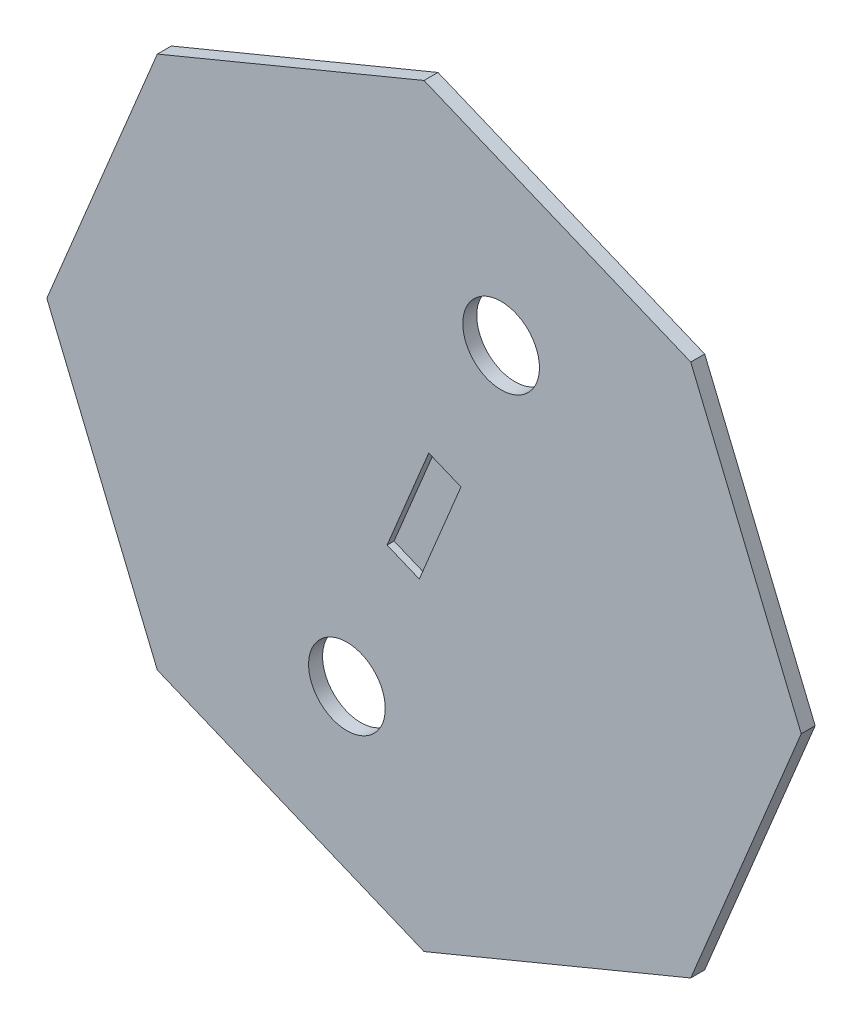
ISO-10303-21;
HEADER;
FILE_DESCRIPTION(('STEP AP214'),'2;1');
FILE_NAME('part.step','',(''),(''),'','','');
FILE_SCHEMA(('AUTOMOTIVE_DESIGN { 1 0 10303 214 1 1 1 1 }'));
ENDSEC;
DATA;
#1=APPLICATION_CONTEXT('core data for automotive mechanical design processes');
#2=APPLICATION_PROTOCOL_DEFINITION('international standard','automotive_design',2000,#1);
#3=PRODUCT_CONTEXT('',#1,'mechanical');
#4=PRODUCT('Part','Part','',(#3));
#5=PRODUCT_RELATED_PRODUCT_CATEGORY('part','',(#4));
#6=PRODUCT_DEFINITION_FORMATION('','',#4);
#7=PRODUCT_DEFINITION_CONTEXT('part definition',#1,'design');
#8=PRODUCT_DEFINITION('design','',#6,#7);
#9=PRODUCT_DEFINITION_SHAPE('','',#8);
#10=(LENGTH_UNIT() NAMED_UNIT(*) SI_UNIT(.MILLI.,.METRE.));
#11=(NAMED_UNIT(*) PLANE_ANGLE_UNIT() SI_UNIT($,.RADIAN.));
#12=(NAMED_UNIT(*) SI_UNIT($,.STERADIAN.) SOLID_ANGLE_UNIT());
#13=UNCERTAINTY_MEASURE_WITH_UNIT(LENGTH_MEASURE(1.E-05),#10,'distance_accuracy_value','');
#14=(GEOMETRIC_REPRESENTATION_CONTEXT(3) GLOBAL_UNCERTAINTY_ASSIGNED_CONTEXT((#13)) GLOBAL_UNIT_ASSIGNED_CONTEXT((#10,
#11,#12)) REPRESENTATION_CONTEXT('',''));
#15=CARTESIAN_POINT('',(0.,0.,0.));
#16=DIRECTION('',(0.,0.,1.));
#17=DIRECTION('',(1.,0.,0.));
#18=AXIS2_PLACEMENT_3D('',#15,#16,#17);
#19=CARTESIAN_POINT('',(76.5366864730186,-76.5366864730173,4.));
#20=DIRECTION('',(-0.92387953251129,0.382683432365081,0.));
#21=DIRECTION('',(-0.382683432365081,-0.92387953251129,0.));
#22=AXIS2_PLACEMENT_3D('',#19,#20,#21);
#23=PLANE('',#22);
#24=DIRECTION('',(0.382683432365081,0.92387953251129,0.));
#25=VECTOR('',#24,1.);
#26=CARTESIAN_POINT('',(76.5366864730186,-76.5366864730173,0.));
#27=LINE('',#26,#25);
#28=CARTESIAN_POINT('',(76.5366864730186,-76.5366864730173,0.));
#29=VERTEX_POINT('',#28);
#30=CARTESIAN_POINT('',(108.239220029239,1.03926162249669E-12,0.));
#31=VERTEX_POINT('',#30);
#32=EDGE_CURVE('E141',#29,#31,#27,.T.);
#33=ORIENTED_EDGE('',*,*,#32,.T.);
#34=DIRECTION('',(0.,0.,-1.));
#35=VECTOR('',#34,1.);
#36=CARTESIAN_POINT('',(108.239220029239,1.03926162249669E-12,4.));
#37=LINE('',#36,#35);
#38=CARTESIAN_POINT('',(108.239220029239,1.03926162249669E-12,4.));
#39=VERTEX_POINT('',#38);
#40=EDGE_CURVE('E11',#39,#31,#37,.T.);
#41=ORIENTED_EDGE('',*,*,#40,.F.);
#42=DIRECTION('',(0.382683432365081,0.92387953251129,0.));
#43=VECTOR('',#42,1.);
#44=CARTESIAN_POINT('',(76.5366864730186,-76.5366864730173,4.));
#45=LINE('',#44,#43);
#46=CARTESIAN_POINT('',(76.5366864730186,-76.5366864730173,4.));
#47=VERTEX_POINT('',#46);
#48=EDGE_CURVE('E157',#47,#39,#45,.T.);
#49=ORIENTED_EDGE('',*,*,#48,.F.);
#50=DIRECTION('',(0.,0.,-1.));
#51=VECTOR('',#50,1.);
#52=CARTESIAN_POINT('',(76.5366864730186,-76.5366864730173,4.));
#53=LINE('',#52,#51);
#54=EDGE_CURVE('E137',#47,#29,#53,.T.);
#55=ORIENTED_EDGE('',*,*,#54,.T.);
#56=EDGE_LOOP('',(#33,#41,#49,#55));
#57=FACE_BOUND('',#56,.T.);
#58=ADVANCED_FACE('F33',(#57),#23,.F.);
#59=CARTESIAN_POINT('',(108.239220029239,1.03926162249669E-12,4.));
#60=DIRECTION('',(-0.923879532511283,-0.382683432365099,0.));
#61=DIRECTION('',(0.382683432365099,-0.923879532511283,0.));
#62=AXIS2_PLACEMENT_3D('',#59,#60,#61);
#63=PLANE('',#62);
#64=DIRECTION('',(-0.382683432365099,0.923879532511283,0.));
#65=VECTOR('',#64,1.);
#66=CARTESIAN_POINT('',(108.239220029239,1.03926162249669E-12,0.));
#67=LINE('',#66,#65);
#68=CARTESIAN_POINT('',(76.5366864730173,76.5366864730186,0.));
#69=VERTEX_POINT('',#68);
#70=EDGE_CURVE('E144',#31,#69,#67,.T.);
#71=ORIENTED_EDGE('',*,*,#70,.T.);
#72=DIRECTION('',(0.,0.,-1.));
#73=VECTOR('',#72,1.);
#74=CARTESIAN_POINT('',(76.5366864730173,76.5366864730186,4.));
#75=LINE('',#74,#73);
#76=CARTESIAN_POINT('',(76.5366864730173,76.5366864730186,4.));
#77=VERTEX_POINT('',#76);
#78=EDGE_CURVE('E40',#77,#69,#75,.T.);
#79=ORIENTED_EDGE('',*,*,#78,.F.);
#80=DIRECTION('',(-0.382683432365099,0.923879532511283,0.));
#81=VECTOR('',#80,1.);
#82=CARTESIAN_POINT('',(108.239220029239,1.03926162249669E-12,4.));
#83=LINE('',#82,#81);
#84=EDGE_CURVE('E97',#39,#77,#83,.T.);
#85=ORIENTED_EDGE('',*,*,#84,.F.);
#86=ORIENTED_EDGE('',*,*,#40,.T.);
#87=EDGE_LOOP('',(#71,#79,#85,#86));
#88=FACE_BOUND('',#87,.T.);
#89=ADVANCED_FACE('F288',(#88),#63,.F.);
#90=CARTESIAN_POINT('',(76.5366864730173,76.5366864730186,4.));
#91=DIRECTION('',(-0.382683432365081,-0.92387953251129,0.));
#92=DIRECTION('',(0.92387953251129,-0.382683432365081,0.));
#93=AXIS2_PLACEMENT_3D('',#90,#91,#92);
#94=PLANE('',#93);
#95=DIRECTION('',(-0.92387953251129,0.382683432365081,0.));
#96=VECTOR('',#95,1.);
#97=CARTESIAN_POINT('',(76.5366864730173,76.5366864730186,0.));
#98=LINE('',#97,#96);
#99=CARTESIAN_POINT('',(-1.01381184269642E-12,108.239220029239,0.));
#100=VERTEX_POINT('',#99);
#101=EDGE_CURVE('E147',#69,#100,#98,.T.);
#102=ORIENTED_EDGE('',*,*,#101,.T.);
#103=DIRECTION('',(0.,0.,-1.));
#104=VECTOR('',#103,1.);
#105=CARTESIAN_POINT('',(-1.01381184269642E-12,108.239220029239,4.));
#106=LINE('',#105,#104);
#107=CARTESIAN_POINT('',(-1.01381184269642E-12,108.239220029239,4.));
#108=VERTEX_POINT('',#107);
#109=EDGE_CURVE('E164',#108,#100,#106,.T.);
#110=ORIENTED_EDGE('',*,*,#109,.F.);
#111=DIRECTION('',(-0.92387953251129,0.382683432365081,0.));
#112=VECTOR('',#111,1.);
#113=CARTESIAN_POINT('',(76.5366864730173,76.5366864730186,4.));
#114=LINE('',#113,#112);
#115=EDGE_CURVE('E172',#77,#108,#114,.T.);
#116=ORIENTED_EDGE('',*,*,#115,.F.);
#117=ORIENTED_EDGE('',*,*,#78,.T.);
#118=EDGE_LOOP('',(#102,#110,#116,#117));
#119=FACE_BOUND('',#118,.T.);
#120=ADVANCED_FACE('F170',(#119),#94,.F.);
#121=CARTESIAN_POINT('',(-1.01381184269642E-12,108.239220029239,4.));
#122=DIRECTION('',(0.382683432365098,-0.923879532511283,0.));
#123=DIRECTION('',(0.923879532511283,0.382683432365098,0.));
#124=AXIS2_PLACEMENT_3D('',#121,#122,#123);
#125=PLANE('',#124);
#126=DIRECTION('',(-0.923879532511283,-0.382683432365098,0.));
#127=VECTOR('',#126,1.);
#128=CARTESIAN_POINT('',(-1.01381184269642E-12,108.239220029239,0.));
#129=LINE('',#128,#127);
#130=CARTESIAN_POINT('',(-76.5366864730187,76.5366864730172,0.));
#131=VERTEX_POINT('',#130);
#132=EDGE_CURVE('E149',#100,#131,#129,.T.);
#133=ORIENTED_EDGE('',*,*,#132,.T.);
#134=DIRECTION('',(0.,0.,-1.));
#135=VECTOR('',#134,1.);
#136=CARTESIAN_POINT('',(-76.5366864730187,76.5366864730172,4.));
#137=LINE('',#136,#135);
#138=CARTESIAN_POINT('',(-76.5366864730187,76.5366864730172,4.));
#139=VERTEX_POINT('',#138);
#140=EDGE_CURVE('E161',#139,#131,#137,.T.);
#141=ORIENTED_EDGE('',*,*,#140,.F.);
#142=DIRECTION('',(-0.923879532511283,-0.382683432365098,0.));
#143=VECTOR('',#142,1.);
#144=CARTESIAN_POINT('',(-1.01381184269642E-12,108.239220029239,4.));
#145=LINE('',#144,#143);
#146=EDGE_CURVE('E184',#108,#139,#145,.T.);
#147=ORIENTED_EDGE('',*,*,#146,.F.);
#148=ORIENTED_EDGE('',*,*,#109,.T.);
#149=EDGE_LOOP('',(#133,#141,#147,#148));
#150=FACE_BOUND('',#149,.T.);
#151=ADVANCED_FACE('F180',(#150),#125,.F.);
#152=CARTESIAN_POINT('',(-76.5366864730187,76.5366864730172,4.));
#153=DIRECTION('',(0.92387953251129,-0.382683432365081,0.));
#154=DIRECTION('',(0.382683432365081,0.92387953251129,0.));
#155=AXIS2_PLACEMENT_3D('',#152,#153,#154);
#156=PLANE('',#155);
#157=DIRECTION('',(-0.382683432365081,-0.92387953251129,0.));
#158=VECTOR('',#157,1.);
#159=CARTESIAN_POINT('',(-76.5366864730187,76.5366864730172,0.));
#160=LINE('',#159,#158);
#161=CARTESIAN_POINT('',(-108.239220029239,-1.00427204748501E-12,0.));
#162=VERTEX_POINT('',#161);
#163=EDGE_CURVE('E151',#131,#162,#160,.T.);
#164=ORIENTED_EDGE('',*,*,#163,.T.);
#165=DIRECTION('',(0.,0.,-1.));
#166=VECTOR('',#165,1.);
#167=CARTESIAN_POINT('',(-108.239220029239,-1.00427204748501E-12,4.));
#168=LINE('',#167,#166);
#169=CARTESIAN_POINT('',(-108.239220029239,-1.00427204748501E-12,4.));
#170=VERTEX_POINT('',#169);
#171=EDGE_CURVE('E132',#170,#162,#168,.T.);
#172=ORIENTED_EDGE('',*,*,#171,.F.);
#173=DIRECTION('',(-0.382683432365081,-0.92387953251129,0.));
#174=VECTOR('',#173,1.);
#175=CARTESIAN_POINT('',(-76.5366864730187,76.5366864730172,4.));
#176=LINE('',#175,#174);
#177=EDGE_CURVE('E120',#139,#170,#176,.T.);
#178=ORIENTED_EDGE('',*,*,#177,.F.);
#179=ORIENTED_EDGE('',*,*,#140,.T.);
#180=EDGE_LOOP('',(#164,#172,#178,#179));
#181=FACE_BOUND('',#180,.T.);
#182=ADVANCED_FACE('F183',(#181),#156,.F.);
#183=CARTESIAN_POINT('',(-108.239220029239,-1.00427204748501E-12,4.));
#184=DIRECTION('',(0.923879532511283,0.382683432365098,0.));
#185=DIRECTION('',(-0.382683432365098,0.923879532511283,0.));
#186=AXIS2_PLACEMENT_3D('',#183,#184,#185);
#187=PLANE('',#186);
#188=DIRECTION('',(0.382683432365098,-0.923879532511283,0.));
#189=VECTOR('',#188,1.);
#190=CARTESIAN_POINT('',(-108.239220029239,-1.00427204748501E-12,0.));
#191=LINE('',#190,#189);
#192=CARTESIAN_POINT('',(-76.5366864730173,-76.5366864730187,0.));
#193=VERTEX_POINT('',#192);
#194=EDGE_CURVE('E129',#162,#193,#191,.T.);
#195=ORIENTED_EDGE('',*,*,#194,.T.);
#196=DIRECTION('',(0.,0.,-1.));
#197=VECTOR('',#196,1.);
#198=CARTESIAN_POINT('',(-76.5366864730173,-76.5366864730187,4.));
#199=LINE('',#198,#197);
#200=CARTESIAN_POINT('',(-76.5366864730173,-76.5366864730187,4.));
#201=VERTEX_POINT('',#200);
#202=EDGE_CURVE('E126',#201,#193,#199,.T.);
#203=ORIENTED_EDGE('',*,*,#202,.F.);
#204=DIRECTION('',(0.382683432365098,-0.923879532511283,0.));
#205=VECTOR('',#204,1.);
#206=CARTESIAN_POINT('',(-108.239220029239,-1.00427204748501E-12,4.));
#207=LINE('',#206,#205);
#208=EDGE_CURVE('E113',#170,#201,#207,.T.);
#209=ORIENTED_EDGE('',*,*,#208,.F.);
#210=ORIENTED_EDGE('',*,*,#171,.T.);
#211=EDGE_LOOP('',(#195,#203,#209,#210));
#212=FACE_BOUND('',#211,.T.);
#213=ADVANCED_FACE('F127',(#212),#187,.F.);
#214=CARTESIAN_POINT('',(-76.5366864730173,-76.5366864730187,4.));
#215=DIRECTION('',(0.382683432365082,0.92387953251129,0.));
#216=DIRECTION('',(-0.92387953251129,0.382683432365082,0.));
#217=AXIS2_PLACEMENT_3D('',#214,#215,#216);
#218=PLANE('',#217);
#219=DIRECTION('',(0.92387953251129,-0.382683432365082,0.));
#220=VECTOR('',#219,1.);
#221=CARTESIAN_POINT('',(-76.5366864730173,-76.5366864730187,0.));
#222=LINE('',#221,#220);
#223=CARTESIAN_POINT('',(9.5925101672389E-13,-108.239220029239,0.));
#224=VERTEX_POINT('',#223);
#225=EDGE_CURVE('E154',#193,#224,#222,.T.);
#226=ORIENTED_EDGE('',*,*,#225,.T.);
#227=DIRECTION('',(0.,0.,-1.));
#228=VECTOR('',#227,1.);
#229=CARTESIAN_POINT('',(9.5925101672389E-13,-108.239220029239,4.));
#230=LINE('',#229,#228);
#231=CARTESIAN_POINT('',(9.5925101672389E-13,-108.239220029239,4.));
#232=VERTEX_POINT('',#231);
#233=EDGE_CURVE('E133',#232,#224,#230,.T.);
#234=ORIENTED_EDGE('',*,*,#233,.F.);
#235=DIRECTION('',(0.92387953251129,-0.382683432365082,0.));
#236=VECTOR('',#235,1.);
#237=CARTESIAN_POINT('',(-76.5366864730173,-76.5366864730187,4.));
#238=LINE('',#237,#236);
#239=EDGE_CURVE('E117',#201,#232,#238,.T.);
#240=ORIENTED_EDGE('',*,*,#239,.F.);
#241=ORIENTED_EDGE('',*,*,#202,.T.);
#242=EDGE_LOOP('',(#226,#234,#240,#241));
#243=FACE_BOUND('',#242,.T.);
#244=ADVANCED_FACE('F135',(#243),#218,.F.);
#245=CARTESIAN_POINT('',(9.5925101672389E-13,-108.239220029239,4.));
#246=DIRECTION('',(-0.382683432365098,0.923879532511283,0.));
#247=DIRECTION('',(-0.923879532511283,-0.382683432365098,0.));
#248=AXIS2_PLACEMENT_3D('',#245,#246,#247);
#249=PLANE('',#248);
#250=DIRECTION('',(0.923879532511283,0.382683432365098,0.));
#251=VECTOR('',#250,1.);
#252=CARTESIAN_POINT('',(9.5925101672389E-13,-108.239220029239,0.));
#253=LINE('',#252,#251);
#254=EDGE_CURVE('E89',#224,#29,#253,.T.);
#255=ORIENTED_EDGE('',*,*,#254,.T.);
#256=ORIENTED_EDGE('',*,*,#54,.F.);
#257=DIRECTION('',(0.923879532511283,0.382683432365098,0.));
#258=VECTOR('',#257,1.);
#259=CARTESIAN_POINT('',(9.5925101672389E-13,-108.239220029239,4.));
#260=LINE('',#259,#258);
#261=EDGE_CURVE('E56',#232,#47,#260,.T.);
#262=ORIENTED_EDGE('',*,*,#261,.F.);
#263=ORIENTED_EDGE('',*,*,#233,.T.);
#264=EDGE_LOOP('',(#255,#256,#262,#263));
#265=FACE_BOUND('',#264,.T.);
#266=ADVANCED_FACE('F245',(#265),#249,.F.);
#267=CARTESIAN_POINT('',(0.,0.,4.));
#268=DIRECTION('',(0.,0.,1.));
#269=DIRECTION('',(1.,0.,0.));
#270=AXIS2_PLACEMENT_3D('',#267,#268,#269);
#271=PLANE('',#270);
#272=CARTESIAN_POINT('',(22.1235732380044,53.4110305593459,4.));
#273=DIRECTION('',(0.,0.,1.));
#274=DIRECTION('',(1.,0.,0.));
#275=AXIS2_PLACEMENT_3D('',#272,#273,#274);
#276=CIRCLE('',#275,11.);
#277=CARTESIAN_POINT('',(33.1235732380044,53.4110305593459,4.));
#278=VERTEX_POINT('',#277);
#279=EDGE_CURVE('E228',#278,#278,#276,.T.);
#280=ORIENTED_EDGE('',*,*,#279,.F.);
#281=EDGE_LOOP('',(#280));
#282=FACE_BOUND('',#281,.T.);
#283=CARTESIAN_POINT('',(-22.1235732380044,-53.4110305593459,4.));
#284=DIRECTION('',(0.,0.,1.));
#285=DIRECTION('',(1.,0.,0.));
#286=AXIS2_PLACEMENT_3D('',#283,#284,#285);
#287=CIRCLE('',#286,11.);
#288=CARTESIAN_POINT('',(-11.1235732380044,-53.4110305593459,4.));
#289=VERTEX_POINT('',#288);
#290=EDGE_CURVE('E222',#289,#289,#287,.T.);
#291=ORIENTED_EDGE('',*,*,#290,.F.);
#292=EDGE_LOOP('',(#291));
#293=FACE_BOUND('',#292,.T.);
#294=DIRECTION('',(0.92387953251129,-0.382683432365082,0.));
#295=VECTOR('',#294,1.);
#296=CARTESIAN_POINT('',(-5.97880323950058,-14.4341078675628,4.));
#297=LINE('',#296,#295);
#298=CARTESIAN_POINT('',(-10.598200902057,-12.5206907057374,4.));
#299=VERTEX_POINT('',#298);
#300=CARTESIAN_POINT('',(-1.35940557694413,-16.3475250293882,4.));
#301=VERTEX_POINT('',#300);
#302=EDGE_CURVE('E47',#299,#301,#297,.T.);
#303=ORIENTED_EDGE('',*,*,#302,.F.);
#304=DIRECTION('',(0.382683432365082,0.92387953251129,0.));
#305=VECTOR('',#304,1.);
#306=CARTESIAN_POINT('',(-4.61939766255645,1.91341716182541,4.));
#307=LINE('',#306,#305);
#308=CARTESIAN_POINT('',(1.35940557694414,16.3475250293882,4.));
#309=VERTEX_POINT('',#308);
#310=EDGE_CURVE('E200',#299,#309,#307,.T.);
#311=ORIENTED_EDGE('',*,*,#310,.T.);
#312=DIRECTION('',(0.92387953251129,-0.382683432365082,0.));
#313=VECTOR('',#312,1.);
#314=CARTESIAN_POINT('',(5.97880323950058,14.4341078675628,4.));
#315=LINE('',#314,#313);
#316=CARTESIAN_POINT('',(10.598200902057,12.5206907057374,4.));
#317=VERTEX_POINT('',#316);
#318=EDGE_CURVE('E204',#309,#317,#315,.T.);
#319=ORIENTED_EDGE('',*,*,#318,.T.);
#320=DIRECTION('',(0.382683432365082,0.92387953251129,0.));
#321=VECTOR('',#320,1.);
#322=CARTESIAN_POINT('',(4.61939766255645,-1.91341716182541,4.));
#323=LINE('',#322,#321);
#324=EDGE_CURVE('E207',#301,#317,#323,.T.);
#325=ORIENTED_EDGE('',*,*,#324,.F.);
#326=EDGE_LOOP('',(#303,#311,#319,#325));
#327=FACE_BOUND('',#326,.T.);
#328=ORIENTED_EDGE('',*,*,#48,.T.);
#329=ORIENTED_EDGE('',*,*,#84,.T.);
#330=ORIENTED_EDGE('',*,*,#115,.T.);
#331=ORIENTED_EDGE('',*,*,#146,.T.);
#332=ORIENTED_EDGE('',*,*,#177,.T.);
#333=ORIENTED_EDGE('',*,*,#208,.T.);
#334=ORIENTED_EDGE('',*,*,#239,.T.);
#335=ORIENTED_EDGE('',*,*,#261,.T.);
#336=EDGE_LOOP('',(#328,#329,#330,#331,#332,#333,#334,#335));
#337=FACE_BOUND('',#336,.T.);
#338=ADVANCED_FACE('F115',(#282,#293,#327,#337),#271,.T.);
#339=CARTESIAN_POINT('',(0.,0.,0.));
#340=DIRECTION('',(0.,0.,1.));
#341=DIRECTION('',(1.,0.,0.));
#342=AXIS2_PLACEMENT_3D('',#339,#340,#341);
#343=PLANE('',#342);
#344=CARTESIAN_POINT('',(22.1235732380044,53.4110305593459,0.));
#345=DIRECTION('',(0.,0.,1.));
#346=DIRECTION('',(1.,0.,0.));
#347=AXIS2_PLACEMENT_3D('',#344,#345,#346);
#348=CIRCLE('',#347,11.);
#349=CARTESIAN_POINT('',(33.1235732380044,53.4110305593459,0.));
#350=VERTEX_POINT('',#349);
#351=EDGE_CURVE('E225',#350,#350,#348,.T.);
#352=ORIENTED_EDGE('',*,*,#351,.T.);
#353=EDGE_LOOP('',(#352));
#354=FACE_BOUND('',#353,.T.);
#355=CARTESIAN_POINT('',(-22.1235732380044,-53.4110305593459,0.));
#356=DIRECTION('',(0.,0.,1.));
#357=DIRECTION('',(1.,0.,0.));
#358=AXIS2_PLACEMENT_3D('',#355,#356,#357);
#359=CIRCLE('',#358,11.);
#360=CARTESIAN_POINT('',(-11.1235732380044,-53.4110305593459,0.));
#361=VERTEX_POINT('',#360);
#362=EDGE_CURVE('E211',#361,#361,#359,.T.);
#363=ORIENTED_EDGE('',*,*,#362,.T.);
#364=EDGE_LOOP('',(#363));
#365=FACE_BOUND('',#364,.T.);
#366=ORIENTED_EDGE('',*,*,#32,.F.);
#367=ORIENTED_EDGE('',*,*,#254,.F.);
#368=ORIENTED_EDGE('',*,*,#225,.F.);
#369=ORIENTED_EDGE('',*,*,#194,.F.);
#370=ORIENTED_EDGE('',*,*,#163,.F.);
#371=ORIENTED_EDGE('',*,*,#132,.F.);
#372=ORIENTED_EDGE('',*,*,#101,.F.);
#373=ORIENTED_EDGE('',*,*,#70,.F.);
#374=EDGE_LOOP('',(#366,#367,#368,#369,#370,#371,#372,#373));
#375=FACE_BOUND('',#374,.T.);
#376=ADVANCED_FACE('F176',(#354,#365,#375),#343,.F.);
#377=CARTESIAN_POINT('',(-5.97880323950058,-14.4341078675628,2.));
#378=DIRECTION('',(-0.382683432365082,-0.92387953251129,0.));
#379=DIRECTION('',(0.92387953251129,-0.382683432365082,0.));
#380=AXIS2_PLACEMENT_3D('',#377,#378,#379);
#381=PLANE('',#380);
#382=ORIENTED_EDGE('',*,*,#302,.T.);
#383=DIRECTION('',(0.,0.,1.));
#384=VECTOR('',#383,1.);
#385=CARTESIAN_POINT('',(-1.35940557694413,-16.3475250293882,2.));
#386=LINE('',#385,#384);
#387=CARTESIAN_POINT('',(-1.35940557694413,-16.3475250293882,2.));
#388=VERTEX_POINT('',#387);
#389=EDGE_CURVE('E190',#388,#301,#386,.T.);
#390=ORIENTED_EDGE('',*,*,#389,.F.);
#391=DIRECTION('',(0.92387953251129,-0.382683432365082,0.));
#392=VECTOR('',#391,1.);
#393=CARTESIAN_POINT('',(-5.97880323950058,-14.4341078675628,2.));
#394=LINE('',#393,#392);
#395=CARTESIAN_POINT('',(-10.598200902057,-12.5206907057374,2.));
#396=VERTEX_POINT('',#395);
#397=EDGE_CURVE('E203',#396,#388,#394,.T.);
#398=ORIENTED_EDGE('',*,*,#397,.F.);
#399=DIRECTION('',(0.,0.,1.));
#400=VECTOR('',#399,1.);
#401=CARTESIAN_POINT('',(-10.598200902057,-12.5206907057374,2.));
#402=LINE('',#401,#400);
#403=EDGE_CURVE('E145',#396,#299,#402,.T.);
#404=ORIENTED_EDGE('',*,*,#403,.T.);
#405=EDGE_LOOP('',(#382,#390,#398,#404));
#406=FACE_BOUND('',#405,.T.);
#407=ADVANCED_FACE('F276',(#406),#381,.F.);
#408=CARTESIAN_POINT('',(-4.61939766255645,1.91341716182541,2.));
#409=DIRECTION('',(0.92387953251129,-0.382683432365082,0.));
#410=DIRECTION('',(0.382683432365082,0.92387953251129,0.));
#411=AXIS2_PLACEMENT_3D('',#408,#409,#410);
#412=PLANE('',#411);
#413=ORIENTED_EDGE('',*,*,#310,.F.);
#414=ORIENTED_EDGE('',*,*,#403,.F.);
#415=DIRECTION('',(0.382683432365082,0.92387953251129,0.));
#416=VECTOR('',#415,1.);
#417=CARTESIAN_POINT('',(-4.61939766255645,1.91341716182541,2.));
#418=LINE('',#417,#416);
#419=CARTESIAN_POINT('',(1.35940557694414,16.3475250293882,2.));
#420=VERTEX_POINT('',#419);
#421=EDGE_CURVE('E193',#396,#420,#418,.T.);
#422=ORIENTED_EDGE('',*,*,#421,.T.);
#423=DIRECTION('',(0.,0.,1.));
#424=VECTOR('',#423,1.);
#425=CARTESIAN_POINT('',(1.35940557694414,16.3475250293882,2.));
#426=LINE('',#425,#424);
#427=EDGE_CURVE('E196',#420,#309,#426,.T.);
#428=ORIENTED_EDGE('',*,*,#427,.T.);
#429=EDGE_LOOP('',(#413,#414,#422,#428));
#430=FACE_BOUND('',#429,.T.);
#431=ADVANCED_FACE('F278',(#430),#412,.T.);
#432=CARTESIAN_POINT('',(5.97880323950058,14.4341078675628,2.));
#433=DIRECTION('',(-0.382683432365082,-0.92387953251129,0.));
#434=DIRECTION('',(0.92387953251129,-0.382683432365082,0.));
#435=AXIS2_PLACEMENT_3D('',#432,#433,#434);
#436=PLANE('',#435);
#437=ORIENTED_EDGE('',*,*,#318,.F.);
#438=ORIENTED_EDGE('',*,*,#427,.F.);
#439=DIRECTION('',(0.92387953251129,-0.382683432365082,0.));
#440=VECTOR('',#439,1.);
#441=CARTESIAN_POINT('',(5.97880323950058,14.4341078675628,2.));
#442=LINE('',#441,#440);
#443=CARTESIAN_POINT('',(10.598200902057,12.5206907057374,2.));
#444=VERTEX_POINT('',#443);
#445=EDGE_CURVE('E214',#420,#444,#442,.T.);
#446=ORIENTED_EDGE('',*,*,#445,.T.);
#447=DIRECTION('',(0.,0.,1.));
#448=VECTOR('',#447,1.);
#449=CARTESIAN_POINT('',(10.598200902057,12.5206907057374,2.));
#450=LINE('',#449,#448);
#451=EDGE_CURVE('E192',#444,#317,#450,.T.);
#452=ORIENTED_EDGE('',*,*,#451,.T.);
#453=EDGE_LOOP('',(#437,#438,#446,#452));
#454=FACE_BOUND('',#453,.T.);
#455=ADVANCED_FACE('F269',(#454),#436,.T.);
#456=CARTESIAN_POINT('',(4.61939766255645,-1.91341716182541,2.));
#457=DIRECTION('',(0.92387953251129,-0.382683432365082,0.));
#458=DIRECTION('',(0.382683432365082,0.92387953251129,0.));
#459=AXIS2_PLACEMENT_3D('',#456,#457,#458);
#460=PLANE('',#459);
#461=ORIENTED_EDGE('',*,*,#324,.T.);
#462=ORIENTED_EDGE('',*,*,#451,.F.);
#463=DIRECTION('',(0.382683432365082,0.92387953251129,0.));
#464=VECTOR('',#463,1.);
#465=CARTESIAN_POINT('',(4.61939766255645,-1.91341716182541,2.));
#466=LINE('',#465,#464);
#467=EDGE_CURVE('E217',#388,#444,#466,.T.);
#468=ORIENTED_EDGE('',*,*,#467,.F.);
#469=ORIENTED_EDGE('',*,*,#389,.T.);
#470=EDGE_LOOP('',(#461,#462,#468,#469));
#471=FACE_BOUND('',#470,.T.);
#472=ADVANCED_FACE('F274',(#471),#460,.F.);
#473=CARTESIAN_POINT('',(0.,0.,2.));
#474=DIRECTION('',(0.,0.,1.));
#475=DIRECTION('',(1.,0.,0.));
#476=AXIS2_PLACEMENT_3D('',#473,#474,#475);
#477=PLANE('',#476);
#478=ORIENTED_EDGE('',*,*,#397,.T.);
#479=ORIENTED_EDGE('',*,*,#467,.T.);
#480=ORIENTED_EDGE('',*,*,#445,.F.);
#481=ORIENTED_EDGE('',*,*,#421,.F.);
#482=EDGE_LOOP('',(#478,#479,#480,#481));
#483=FACE_BOUND('',#482,.T.);
#484=ADVANCED_FACE('F275',(#483),#477,.T.);
#485=CARTESIAN_POINT('',(-22.1235732380044,-53.4110305593459,0.));
#486=DIRECTION('',(0.,0.,1.));
#487=DIRECTION('',(1.,0.,0.));
#488=AXIS2_PLACEMENT_3D('',#485,#486,#487);
#489=CYLINDRICAL_SURFACE('',#488,11.);
#490=ORIENTED_EDGE('',*,*,#362,.F.);
#491=EDGE_LOOP('',(#490));
#492=FACE_BOUND('',#491,.T.);
#493=ORIENTED_EDGE('',*,*,#290,.T.);
#494=EDGE_LOOP('',(#493));
#495=FACE_BOUND('',#494,.T.);
#496=ADVANCED_FACE('F239',(#492,#495),#489,.F.);
#497=CARTESIAN_POINT('',(22.1235732380044,53.4110305593459,0.));
#498=DIRECTION('',(0.,0.,1.));
#499=DIRECTION('',(1.,0.,0.));
#500=AXIS2_PLACEMENT_3D('',#497,#498,#499);
#501=CYLINDRICAL_SURFACE('',#500,11.);
#502=ORIENTED_EDGE('',*,*,#351,.F.);
#503=EDGE_LOOP('',(#502));
#504=FACE_BOUND('',#503,.T.);
#505=ORIENTED_EDGE('',*,*,#279,.T.);
#506=EDGE_LOOP('',(#505));
#507=FACE_BOUND('',#506,.T.);
#508=ADVANCED_FACE('F236',(#504,#507),#501,.F.);
#509=CLOSED_SHELL('',(#58,#89,#120,#151,#182,#213,#244,#266,#338,#376,#407,#431,#455,#472,#484,
#496,#508));
#510=MANIFOLD_SOLID_BREP('B2',#509);
#511=ADVANCED_BREP_SHAPE_REPRESENTATION('',(#18,#510),#14);
#512=SHAPE_DEFINITION_REPRESENTATION(#9,#511);
ENDSEC;
END-ISO-10303-21;
